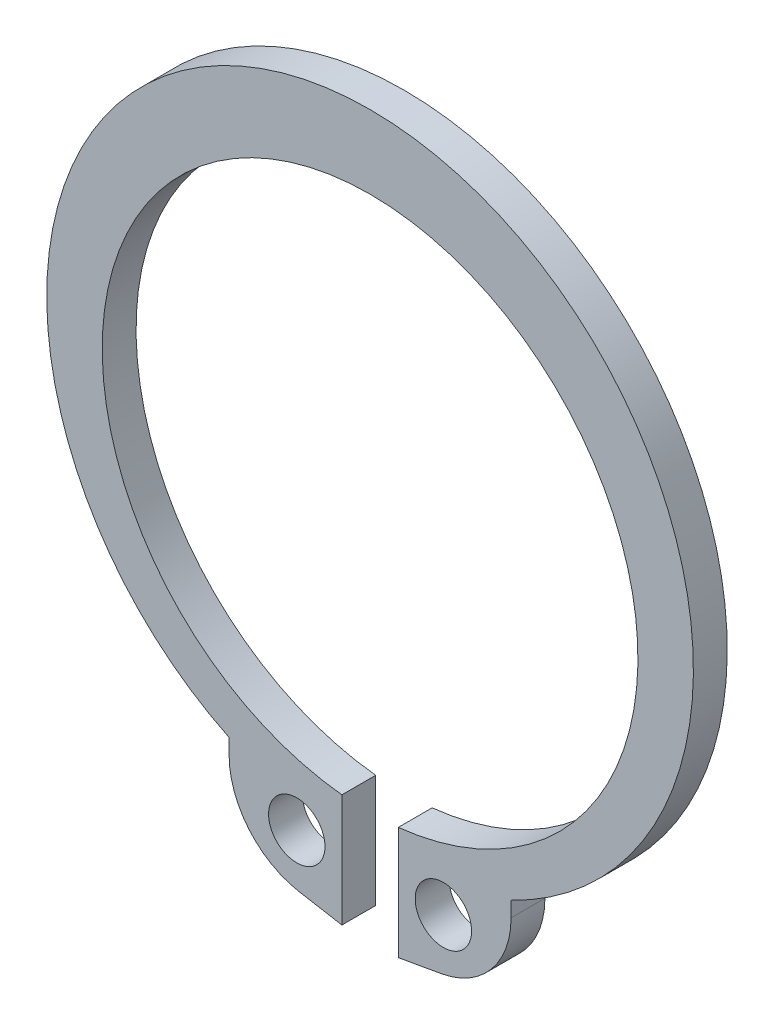
ISO-10303-21;
HEADER;
FILE_DESCRIPTION(('STEP AP214'),'2;1');
FILE_NAME('part.step','',(''),(''),'','','');
FILE_SCHEMA(('AUTOMOTIVE_DESIGN { 1 0 10303 214 1 1 1 1 }'));
ENDSEC;
DATA;
#1=APPLICATION_CONTEXT('core data for automotive mechanical design processes');
#2=APPLICATION_PROTOCOL_DEFINITION('international standard','automotive_design',2000,#1);
#3=PRODUCT_CONTEXT('',#1,'mechanical');
#4=PRODUCT('Part','Part','',(#3));
#5=PRODUCT_RELATED_PRODUCT_CATEGORY('part','',(#4));
#6=PRODUCT_DEFINITION_FORMATION('','',#4);
#7=PRODUCT_DEFINITION_CONTEXT('part definition',#1,'design');
#8=PRODUCT_DEFINITION('design','',#6,#7);
#9=PRODUCT_DEFINITION_SHAPE('','',#8);
#10=(LENGTH_UNIT() NAMED_UNIT(*) SI_UNIT(.MILLI.,.METRE.));
#11=(NAMED_UNIT(*) PLANE_ANGLE_UNIT() SI_UNIT($,.RADIAN.));
#12=(NAMED_UNIT(*) SI_UNIT($,.STERADIAN.) SOLID_ANGLE_UNIT());
#13=UNCERTAINTY_MEASURE_WITH_UNIT(LENGTH_MEASURE(1.E-05),#10,'distance_accuracy_value','');
#14=(GEOMETRIC_REPRESENTATION_CONTEXT(3) GLOBAL_UNCERTAINTY_ASSIGNED_CONTEXT((#13)) GLOBAL_UNIT_ASSIGNED_CONTEXT((#10,
#11,#12)) REPRESENTATION_CONTEXT('',''));
#15=CARTESIAN_POINT('',(0.,0.,0.));
#16=DIRECTION('',(0.,0.,1.));
#17=DIRECTION('',(1.,0.,0.));
#18=AXIS2_PLACEMENT_3D('',#15,#16,#17);
#19=CARTESIAN_POINT('',(0.,-1.52791289356614,1.2));
#20=DIRECTION('',(0.,0.,1.));
#21=DIRECTION('',(1.,0.,0.));
#22=AXIS2_PLACEMENT_3D('',#19,#20,#21);
#23=PLANE('',#22);
#24=CARTESIAN_POINT('',(-2.6,-11.3373307433177,1.2));
#25=DIRECTION('',(0.,0.,1.));
#26=DIRECTION('',(1.,0.,0.));
#27=AXIS2_PLACEMENT_3D('',#24,#25,#26);
#28=CIRCLE('',#27,1.);
#29=CARTESIAN_POINT('',(-1.6,-11.3373307433177,1.2));
#30=VERTEX_POINT('',#29);
#31=EDGE_CURVE('E158',#30,#30,#28,.F.);
#32=ORIENTED_EDGE('',*,*,#31,.T.);
#33=EDGE_LOOP('',(#32));
#34=FACE_BOUND('',#33,.T.);
#35=CARTESIAN_POINT('',(2.6,-11.3373307433177,1.2));
#36=DIRECTION('',(0.,0.,1.));
#37=DIRECTION('',(1.,0.,0.));
#38=AXIS2_PLACEMENT_3D('',#35,#36,#37);
#39=CIRCLE('',#38,1.);
#40=CARTESIAN_POINT('',(3.6,-11.3373307433177,1.2));
#41=VERTEX_POINT('',#40);
#42=EDGE_CURVE('E161',#41,#41,#39,.F.);
#43=ORIENTED_EDGE('',*,*,#42,.T.);
#44=EDGE_LOOP('',(#43));
#45=FACE_BOUND('',#44,.T.);
#46=DIRECTION('',(0.,-1.,0.));
#47=VECTOR('',#46,1.);
#48=CARTESIAN_POINT('',(1.,-13.4472218138456,1.2));
#49=LINE('',#48,#47);
#50=CARTESIAN_POINT('',(0.999999999999995,-13.4472218138456,1.2));
#51=VERTEX_POINT('',#50);
#52=CARTESIAN_POINT('',(0.999999999999999,-9.44722181384559,1.2));
#53=VERTEX_POINT('',#52);
#54=EDGE_CURVE('E124',#51,#53,#49,.F.);
#55=ORIENTED_EDGE('',*,*,#54,.F.);
#56=DIRECTION('',(0.984807753012208,0.17364817766693,0.));
#57=VECTOR('',#56,1.);
#58=CARTESIAN_POINT('',(5.,-12.7419138910117,1.2));
#59=LINE('',#58,#57);
#60=CARTESIAN_POINT('',(2.52094453300079,-13.1790382565165,1.2));
#61=VERTEX_POINT('',#60);
#62=EDGE_CURVE('E117',#61,#51,#59,.F.);
#63=ORIENTED_EDGE('',*,*,#62,.F.);
#64=CARTESIAN_POINT('',(2.,-10.2246149974799,1.2));
#65=DIRECTION('',(0.,0.,1.));
#66=DIRECTION('',(1.,0.,0.));
#67=AXIS2_PLACEMENT_3D('',#64,#65,#66);
#68=CIRCLE('',#67,3.);
#69=CARTESIAN_POINT('',(5.,-10.2246149974799,1.2));
#70=VERTEX_POINT('',#69);
#71=EDGE_CURVE('E104',#70,#61,#68,.F.);
#72=ORIENTED_EDGE('',*,*,#71,.F.);
#73=DIRECTION('',(0.,1.,0.));
#74=VECTOR('',#73,1.);
#75=CARTESIAN_POINT('',(5.,-9.68579669029,1.2));
#76=LINE('',#75,#74);
#77=CARTESIAN_POINT('',(5.00000000000001,-9.68579669029003,1.2));
#78=VERTEX_POINT('',#77);
#79=EDGE_CURVE('E100',#78,#70,#76,.F.);
#80=ORIENTED_EDGE('',*,*,#79,.F.);
#81=CARTESIAN_POINT('',(0.,0.633333333333333,1.2));
#82=DIRECTION('',(0.,0.,1.));
#83=DIRECTION('',(1.,0.,0.));
#84=AXIS2_PLACEMENT_3D('',#81,#82,#83);
#85=CIRCLE('',#84,11.4666666666667);
#86=CARTESIAN_POINT('',(-5.,-9.68579669029002,1.2));
#87=VERTEX_POINT('',#86);
#88=EDGE_CURVE('E20',#87,#78,#85,.F.);
#89=ORIENTED_EDGE('',*,*,#88,.F.);
#90=DIRECTION('',(0.,-1.,0.));
#91=VECTOR('',#90,1.);
#92=CARTESIAN_POINT('',(-5.,-12.7419138910117,1.2));
#93=LINE('',#92,#91);
#94=CARTESIAN_POINT('',(-5.,-10.2246149974799,1.2));
#95=VERTEX_POINT('',#94);
#96=EDGE_CURVE('E87',#95,#87,#93,.F.);
#97=ORIENTED_EDGE('',*,*,#96,.F.);
#98=CARTESIAN_POINT('',(-2.,-10.2246149974799,1.2));
#99=DIRECTION('',(0.,0.,1.));
#100=DIRECTION('',(1.,0.,0.));
#101=AXIS2_PLACEMENT_3D('',#98,#99,#100);
#102=CIRCLE('',#101,3.);
#103=CARTESIAN_POINT('',(-2.52094453300079,-13.1790382565165,1.2));
#104=VERTEX_POINT('',#103);
#105=EDGE_CURVE('E168',#104,#95,#102,.F.);
#106=ORIENTED_EDGE('',*,*,#105,.F.);
#107=DIRECTION('',(0.984807753012208,-0.17364817766693,0.));
#108=VECTOR('',#107,1.);
#109=CARTESIAN_POINT('',(-0.999999999999998,-13.4472218138456,1.2));
#110=LINE('',#109,#108);
#111=CARTESIAN_POINT('',(-0.999999999999998,-13.4472218138456,1.2));
#112=VERTEX_POINT('',#111);
#113=EDGE_CURVE('E133',#112,#104,#110,.F.);
#114=ORIENTED_EDGE('',*,*,#113,.F.);
#115=DIRECTION('',(0.,1.,0.));
#116=VECTOR('',#115,1.);
#117=CARTESIAN_POINT('',(-0.999999999999999,-9.44722181384559,1.2));
#118=LINE('',#117,#116);
#119=CARTESIAN_POINT('',(-0.999999999999999,-9.44722181384559,1.2));
#120=VERTEX_POINT('',#119);
#121=EDGE_CURVE('E129',#120,#112,#118,.F.);
#122=ORIENTED_EDGE('',*,*,#121,.F.);
#123=CARTESIAN_POINT('',(0.,0.,1.2));
#124=DIRECTION('',(0.,0.,1.));
#125=DIRECTION('',(1.,0.,0.));
#126=AXIS2_PLACEMENT_3D('',#123,#124,#125);
#127=CIRCLE('',#126,9.5);
#128=EDGE_CURVE('E126',#120,#53,#127,.F.);
#129=ORIENTED_EDGE('',*,*,#128,.T.);
#130=EDGE_LOOP('',(#55,#63,#72,#80,#89,#97,#106,#114,#122,#129));
#131=FACE_BOUND('',#130,.T.);
#132=ADVANCED_FACE('F17',(#34,#45,#131),#23,.T.);
#133=CARTESIAN_POINT('',(5.,-9.68579669029,0.));
#134=DIRECTION('',(1.,0.,0.));
#135=DIRECTION('',(0.,0.,-1.));
#136=AXIS2_PLACEMENT_3D('',#133,#134,#135);
#137=PLANE('',#136);
#138=DIRECTION('',(0.,0.,1.));
#139=VECTOR('',#138,1.);
#140=CARTESIAN_POINT('',(5.00000000000001,-9.68579669029003,0.));
#141=LINE('',#140,#139);
#142=CARTESIAN_POINT('',(5.00000000000001,-9.68579669029003,0.));
#143=VERTEX_POINT('',#142);
#144=EDGE_CURVE('E96',#78,#143,#141,.F.);
#145=ORIENTED_EDGE('',*,*,#144,.F.);
#146=ORIENTED_EDGE('',*,*,#79,.T.);
#147=DIRECTION('',(0.,0.,1.));
#148=VECTOR('',#147,1.);
#149=CARTESIAN_POINT('',(5.,-10.2246149974799,0.));
#150=LINE('',#149,#148);
#151=CARTESIAN_POINT('',(5.,-10.2246149974799,0.));
#152=VERTEX_POINT('',#151);
#153=EDGE_CURVE('E164',#152,#70,#150,.T.);
#154=ORIENTED_EDGE('',*,*,#153,.F.);
#155=DIRECTION('',(0.,1.,0.));
#156=VECTOR('',#155,1.);
#157=CARTESIAN_POINT('',(5.,-1.52791289356614,0.));
#158=LINE('',#157,#156);
#159=EDGE_CURVE('E111',#152,#143,#158,.T.);
#160=ORIENTED_EDGE('',*,*,#159,.T.);
#161=EDGE_LOOP('',(#145,#146,#154,#160));
#162=FACE_BOUND('',#161,.T.);
#163=ADVANCED_FACE('F110',(#162),#137,.T.);
#164=CARTESIAN_POINT('',(0.,0.633333333333333,0.));
#165=DIRECTION('',(0.,0.,1.));
#166=DIRECTION('',(1.,0.,0.));
#167=AXIS2_PLACEMENT_3D('',#164,#165,#166);
#168=CYLINDRICAL_SURFACE('',#167,11.4666666666667);
#169=CARTESIAN_POINT('',(0.,0.633333333333333,0.));
#170=DIRECTION('',(0.,0.,1.));
#171=DIRECTION('',(1.,0.,0.));
#172=AXIS2_PLACEMENT_3D('',#169,#170,#171);
#173=CIRCLE('',#172,11.4666666666667);
#174=CARTESIAN_POINT('',(-5.,-9.68579669029002,0.));
#175=VERTEX_POINT('',#174);
#176=EDGE_CURVE('E156',#143,#175,#173,.T.);
#177=ORIENTED_EDGE('',*,*,#176,.T.);
#178=DIRECTION('',(0.,0.,1.));
#179=VECTOR('',#178,1.);
#180=CARTESIAN_POINT('',(-5.,-9.68579669029,0.));
#181=LINE('',#180,#179);
#182=EDGE_CURVE('E98',#87,#175,#181,.F.);
#183=ORIENTED_EDGE('',*,*,#182,.F.);
#184=ORIENTED_EDGE('',*,*,#88,.T.);
#185=ORIENTED_EDGE('',*,*,#144,.T.);
#186=EDGE_LOOP('',(#177,#183,#184,#185));
#187=FACE_BOUND('',#186,.T.);
#188=ADVANCED_FACE('F94',(#187),#168,.T.);
#189=CARTESIAN_POINT('',(-5.,-12.7419138910117,0.));
#190=DIRECTION('',(-1.,0.,0.));
#191=DIRECTION('',(0.,-1.,0.));
#192=AXIS2_PLACEMENT_3D('',#189,#190,#191);
#193=PLANE('',#192);
#194=ORIENTED_EDGE('',*,*,#182,.T.);
#195=DIRECTION('',(0.,1.,0.));
#196=VECTOR('',#195,1.);
#197=CARTESIAN_POINT('',(-5.,-1.52791289356614,0.));
#198=LINE('',#197,#196);
#199=CARTESIAN_POINT('',(-5.,-10.2246149974799,0.));
#200=VERTEX_POINT('',#199);
#201=EDGE_CURVE('E155',#175,#200,#198,.F.);
#202=ORIENTED_EDGE('',*,*,#201,.T.);
#203=DIRECTION('',(0.,0.,1.));
#204=VECTOR('',#203,1.);
#205=CARTESIAN_POINT('',(-5.,-10.2246149974799,0.));
#206=LINE('',#205,#204);
#207=EDGE_CURVE('E169',#95,#200,#206,.F.);
#208=ORIENTED_EDGE('',*,*,#207,.F.);
#209=ORIENTED_EDGE('',*,*,#96,.T.);
#210=EDGE_LOOP('',(#194,#202,#208,#209));
#211=FACE_BOUND('',#210,.T.);
#212=ADVANCED_FACE('F174',(#211),#193,.T.);
#213=CARTESIAN_POINT('',(-2.,-10.2246149974799,0.));
#214=DIRECTION('',(0.,0.,1.));
#215=DIRECTION('',(1.,0.,0.));
#216=AXIS2_PLACEMENT_3D('',#213,#214,#215);
#217=CYLINDRICAL_SURFACE('',#216,3.);
#218=CARTESIAN_POINT('',(-2.,-10.2246149974799,0.));
#219=DIRECTION('',(0.,0.,1.));
#220=DIRECTION('',(1.,0.,0.));
#221=AXIS2_PLACEMENT_3D('',#218,#219,#220);
#222=CIRCLE('',#221,3.);
#223=CARTESIAN_POINT('',(-2.52094453300081,-13.1790382565165,0.));
#224=VERTEX_POINT('',#223);
#225=EDGE_CURVE('E151',#200,#224,#222,.T.);
#226=ORIENTED_EDGE('',*,*,#225,.T.);
#227=DIRECTION('',(0.,0.,1.));
#228=VECTOR('',#227,1.);
#229=CARTESIAN_POINT('',(-2.52094453300079,-13.1790382565165,0.));
#230=LINE('',#229,#228);
#231=EDGE_CURVE('E138',#104,#224,#230,.F.);
#232=ORIENTED_EDGE('',*,*,#231,.F.);
#233=ORIENTED_EDGE('',*,*,#105,.T.);
#234=ORIENTED_EDGE('',*,*,#207,.T.);
#235=EDGE_LOOP('',(#226,#232,#233,#234));
#236=FACE_BOUND('',#235,.T.);
#237=ADVANCED_FACE('F206',(#236),#217,.T.);
#238=CARTESIAN_POINT('',(-0.999999999999998,-13.4472218138456,0.));
#239=DIRECTION('',(-0.17364817766693,-0.984807753012208,0.));
#240=DIRECTION('',(0.984807753012208,-0.17364817766693,0.));
#241=AXIS2_PLACEMENT_3D('',#238,#239,#240);
#242=PLANE('',#241);
#243=DIRECTION('',(0.,0.,1.));
#244=VECTOR('',#243,1.);
#245=CARTESIAN_POINT('',(-0.999999999999998,-13.4472218138456,0.));
#246=LINE('',#245,#244);
#247=CARTESIAN_POINT('',(-0.999999999999998,-13.4472218138456,0.));
#248=VERTEX_POINT('',#247);
#249=EDGE_CURVE('E132',#112,#248,#246,.F.);
#250=ORIENTED_EDGE('',*,*,#249,.F.);
#251=ORIENTED_EDGE('',*,*,#113,.T.);
#252=ORIENTED_EDGE('',*,*,#231,.T.);
#253=DIRECTION('',(0.984807753012205,-0.173648177666945,0.));
#254=VECTOR('',#253,1.);
#255=CARTESIAN_POINT('',(-2.52094453300079,-13.1790382565165,0.));
#256=LINE('',#255,#254);
#257=EDGE_CURVE('E154',#224,#248,#256,.T.);
#258=ORIENTED_EDGE('',*,*,#257,.T.);
#259=EDGE_LOOP('',(#250,#251,#252,#258));
#260=FACE_BOUND('',#259,.T.);
#261=ADVANCED_FACE('F201',(#260),#242,.T.);
#262=CARTESIAN_POINT('',(-0.999999999999999,-9.44722181384559,0.));
#263=DIRECTION('',(1.,0.,0.));
#264=DIRECTION('',(0.,1.,0.));
#265=AXIS2_PLACEMENT_3D('',#262,#263,#264);
#266=PLANE('',#265);
#267=DIRECTION('',(0.,1.,0.));
#268=VECTOR('',#267,1.);
#269=CARTESIAN_POINT('',(-0.999999999999998,-1.52791289356614,0.));
#270=LINE('',#269,#268);
#271=CARTESIAN_POINT('',(-0.999999999999998,-9.44722181384559,0.));
#272=VERTEX_POINT('',#271);
#273=EDGE_CURVE('E150',#248,#272,#270,.T.);
#274=ORIENTED_EDGE('',*,*,#273,.T.);
#275=DIRECTION('',(0.,0.,1.));
#276=VECTOR('',#275,1.);
#277=CARTESIAN_POINT('',(-0.999999999999999,-9.44722181384559,0.));
#278=LINE('',#277,#276);
#279=EDGE_CURVE('E167',#272,#120,#278,.T.);
#280=ORIENTED_EDGE('',*,*,#279,.T.);
#281=ORIENTED_EDGE('',*,*,#121,.T.);
#282=ORIENTED_EDGE('',*,*,#249,.T.);
#283=EDGE_LOOP('',(#274,#280,#281,#282));
#284=FACE_BOUND('',#283,.T.);
#285=ADVANCED_FACE('F214',(#284),#266,.T.);
#286=CARTESIAN_POINT('',(0.,0.,0.));
#287=DIRECTION('',(0.,0.,1.));
#288=DIRECTION('',(1.,0.,0.));
#289=AXIS2_PLACEMENT_3D('',#286,#287,#288);
#290=CYLINDRICAL_SURFACE('',#289,9.5);
#291=ORIENTED_EDGE('',*,*,#279,.F.);
#292=CARTESIAN_POINT('',(0.,0.,0.));
#293=DIRECTION('',(0.,0.,1.));
#294=DIRECTION('',(1.,0.,0.));
#295=AXIS2_PLACEMENT_3D('',#292,#293,#294);
#296=CIRCLE('',#295,9.5);
#297=CARTESIAN_POINT('',(1.,-9.44722181384559,0.));
#298=VERTEX_POINT('',#297);
#299=EDGE_CURVE('E146',#272,#298,#296,.F.);
#300=ORIENTED_EDGE('',*,*,#299,.T.);
#301=DIRECTION('',(0.,0.,1.));
#302=VECTOR('',#301,1.);
#303=CARTESIAN_POINT('',(0.999999999999999,-9.44722181384559,0.));
#304=LINE('',#303,#302);
#305=EDGE_CURVE('E121',#53,#298,#304,.F.);
#306=ORIENTED_EDGE('',*,*,#305,.F.);
#307=ORIENTED_EDGE('',*,*,#128,.F.);
#308=EDGE_LOOP('',(#291,#300,#306,#307));
#309=FACE_BOUND('',#308,.T.);
#310=ADVANCED_FACE('F243',(#309),#290,.F.);
#311=CARTESIAN_POINT('',(1.,-13.4472218138456,0.));
#312=DIRECTION('',(-1.,0.,0.));
#313=DIRECTION('',(0.,-1.,0.));
#314=AXIS2_PLACEMENT_3D('',#311,#312,#313);
#315=PLANE('',#314);
#316=DIRECTION('',(0.,1.,0.));
#317=VECTOR('',#316,1.);
#318=CARTESIAN_POINT('',(1.,-1.52791289356614,0.));
#319=LINE('',#318,#317);
#320=CARTESIAN_POINT('',(0.999999999999997,-13.4472218138456,0.));
#321=VERTEX_POINT('',#320);
#322=EDGE_CURVE('E149',#298,#321,#319,.F.);
#323=ORIENTED_EDGE('',*,*,#322,.T.);
#324=DIRECTION('',(0.,0.,1.));
#325=VECTOR('',#324,1.);
#326=CARTESIAN_POINT('',(0.999999999999992,-13.4472218138456,0.));
#327=LINE('',#326,#325);
#328=EDGE_CURVE('E120',#51,#321,#327,.F.);
#329=ORIENTED_EDGE('',*,*,#328,.F.);
#330=ORIENTED_EDGE('',*,*,#54,.T.);
#331=ORIENTED_EDGE('',*,*,#305,.T.);
#332=EDGE_LOOP('',(#323,#329,#330,#331));
#333=FACE_BOUND('',#332,.T.);
#334=ADVANCED_FACE('F239',(#333),#315,.T.);
#335=CARTESIAN_POINT('',(5.,-12.7419138910117,0.));
#336=DIRECTION('',(0.17364817766693,-0.984807753012208,0.));
#337=DIRECTION('',(0.984807753012208,0.17364817766693,0.));
#338=AXIS2_PLACEMENT_3D('',#335,#336,#337);
#339=PLANE('',#338);
#340=ORIENTED_EDGE('',*,*,#328,.T.);
#341=DIRECTION('',(0.984807753012205,0.173648177666945,0.));
#342=VECTOR('',#341,1.);
#343=CARTESIAN_POINT('',(1.,-13.4472218138456,0.));
#344=LINE('',#343,#342);
#345=CARTESIAN_POINT('',(2.52094453300081,-13.1790382565165,0.));
#346=VERTEX_POINT('',#345);
#347=EDGE_CURVE('E145',#321,#346,#344,.T.);
#348=ORIENTED_EDGE('',*,*,#347,.T.);
#349=DIRECTION('',(0.,0.,1.));
#350=VECTOR('',#349,1.);
#351=CARTESIAN_POINT('',(2.52094453300079,-13.1790382565165,0.));
#352=LINE('',#351,#350);
#353=EDGE_CURVE('E35',#61,#346,#352,.F.);
#354=ORIENTED_EDGE('',*,*,#353,.F.);
#355=ORIENTED_EDGE('',*,*,#62,.T.);
#356=EDGE_LOOP('',(#340,#348,#354,#355));
#357=FACE_BOUND('',#356,.T.);
#358=ADVANCED_FACE('F236',(#357),#339,.T.);
#359=CARTESIAN_POINT('',(2.,-10.2246149974799,0.));
#360=DIRECTION('',(0.,0.,1.));
#361=DIRECTION('',(1.,0.,0.));
#362=AXIS2_PLACEMENT_3D('',#359,#360,#361);
#363=CYLINDRICAL_SURFACE('',#362,3.);
#364=CARTESIAN_POINT('',(2.,-10.2246149974799,0.));
#365=DIRECTION('',(0.,0.,1.));
#366=DIRECTION('',(1.,0.,0.));
#367=AXIS2_PLACEMENT_3D('',#364,#365,#366);
#368=CIRCLE('',#367,3.);
#369=EDGE_CURVE('E143',#346,#152,#368,.T.);
#370=ORIENTED_EDGE('',*,*,#369,.T.);
#371=ORIENTED_EDGE('',*,*,#153,.T.);
#372=ORIENTED_EDGE('',*,*,#71,.T.);
#373=ORIENTED_EDGE('',*,*,#353,.T.);
#374=EDGE_LOOP('',(#370,#371,#372,#373));
#375=FACE_BOUND('',#374,.T.);
#376=ADVANCED_FACE('F232',(#375),#363,.T.);
#377=CARTESIAN_POINT('',(2.6,-11.3373307433177,-33.1516858419439));
#378=DIRECTION('',(0.,0.,1.));
#379=DIRECTION('',(1.,0.,0.));
#380=AXIS2_PLACEMENT_3D('',#377,#378,#379);
#381=CYLINDRICAL_SURFACE('',#380,1.);
#382=ORIENTED_EDGE('',*,*,#42,.F.);
#383=EDGE_LOOP('',(#382));
#384=FACE_BOUND('',#383,.T.);
#385=CARTESIAN_POINT('',(2.6,-11.3373307433177,0.));
#386=DIRECTION('',(0.,0.,1.));
#387=DIRECTION('',(1.,0.,0.));
#388=AXIS2_PLACEMENT_3D('',#385,#386,#387);
#389=CIRCLE('',#388,1.);
#390=CARTESIAN_POINT('',(3.6,-11.3373307433177,0.));
#391=VERTEX_POINT('',#390);
#392=EDGE_CURVE('E26',#391,#391,#389,.F.);
#393=ORIENTED_EDGE('',*,*,#392,.T.);
#394=EDGE_LOOP('',(#393));
#395=FACE_BOUND('',#394,.T.);
#396=ADVANCED_FACE('F224',(#384,#395),#381,.F.);
#397=CARTESIAN_POINT('',(-2.6,-11.3373307433177,-33.1516858419439));
#398=DIRECTION('',(0.,0.,1.));
#399=DIRECTION('',(1.,0.,0.));
#400=AXIS2_PLACEMENT_3D('',#397,#398,#399);
#401=CYLINDRICAL_SURFACE('',#400,1.);
#402=ORIENTED_EDGE('',*,*,#31,.F.);
#403=EDGE_LOOP('',(#402));
#404=FACE_BOUND('',#403,.T.);
#405=CARTESIAN_POINT('',(-2.6,-11.3373307433177,0.));
#406=DIRECTION('',(0.,0.,1.));
#407=DIRECTION('',(1.,0.,0.));
#408=AXIS2_PLACEMENT_3D('',#405,#406,#407);
#409=CIRCLE('',#408,1.);
#410=CARTESIAN_POINT('',(-1.6,-11.3373307433177,0.));
#411=VERTEX_POINT('',#410);
#412=EDGE_CURVE('E11',#411,#411,#409,.F.);
#413=ORIENTED_EDGE('',*,*,#412,.T.);
#414=EDGE_LOOP('',(#413));
#415=FACE_BOUND('',#414,.T.);
#416=ADVANCED_FACE('F218',(#404,#415),#401,.F.);
#417=CARTESIAN_POINT('',(0.,-1.52791289356614,0.));
#418=DIRECTION('',(0.,0.,1.));
#419=DIRECTION('',(1.,0.,0.));
#420=AXIS2_PLACEMENT_3D('',#417,#418,#419);
#421=PLANE('',#420);
#422=ORIENTED_EDGE('',*,*,#412,.F.);
#423=EDGE_LOOP('',(#422));
#424=FACE_BOUND('',#423,.T.);
#425=ORIENTED_EDGE('',*,*,#392,.F.);
#426=EDGE_LOOP('',(#425));
#427=FACE_BOUND('',#426,.T.);
#428=ORIENTED_EDGE('',*,*,#347,.F.);
#429=ORIENTED_EDGE('',*,*,#322,.F.);
#430=ORIENTED_EDGE('',*,*,#299,.F.);
#431=ORIENTED_EDGE('',*,*,#273,.F.);
#432=ORIENTED_EDGE('',*,*,#257,.F.);
#433=ORIENTED_EDGE('',*,*,#225,.F.);
#434=ORIENTED_EDGE('',*,*,#201,.F.);
#435=ORIENTED_EDGE('',*,*,#176,.F.);
#436=ORIENTED_EDGE('',*,*,#159,.F.);
#437=ORIENTED_EDGE('',*,*,#369,.F.);
#438=EDGE_LOOP('',(#428,#429,#430,#431,#432,#433,#434,#435,#436,#437));
#439=FACE_BOUND('',#438,.T.);
#440=ADVANCED_FACE('F178',(#424,#427,#439),#421,.F.);
#441=CLOSED_SHELL('',(#132,#163,#188,#212,#237,#261,#285,#310,#334,#358,#376,#396,#416,#440));
#442=MANIFOLD_SOLID_BREP('B1',#441);
#443=ADVANCED_BREP_SHAPE_REPRESENTATION('',(#18,#442),#14);
#444=SHAPE_DEFINITION_REPRESENTATION(#9,#443);
ENDSEC;
END-ISO-10303-21;
